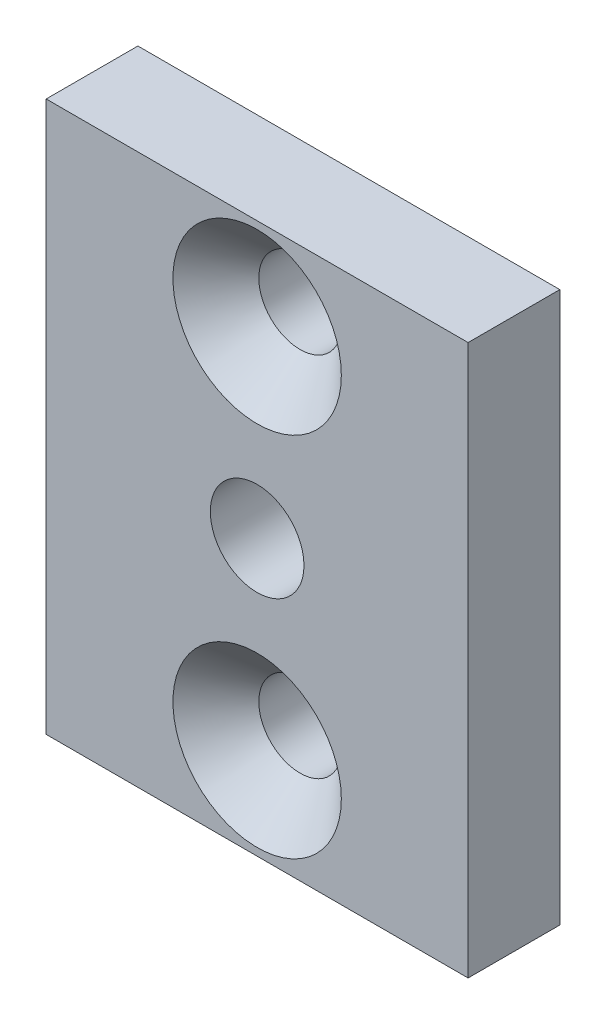
ISO-10303-21;
HEADER;
FILE_DESCRIPTION(('STEP AP214'),'2;1');
FILE_NAME('part.step','',(''),(''),'','','');
FILE_SCHEMA(('AUTOMOTIVE_DESIGN { 1 0 10303 214 1 1 1 1 }'));
ENDSEC;
DATA;
#1=APPLICATION_CONTEXT('core data for automotive mechanical design processes');
#2=APPLICATION_PROTOCOL_DEFINITION('international standard','automotive_design',2000,#1);
#3=PRODUCT_CONTEXT('',#1,'mechanical');
#4=PRODUCT('Part','Part','',(#3));
#5=PRODUCT_RELATED_PRODUCT_CATEGORY('part','',(#4));
#6=PRODUCT_DEFINITION_FORMATION('','',#4);
#7=PRODUCT_DEFINITION_CONTEXT('part definition',#1,'design');
#8=PRODUCT_DEFINITION('design','',#6,#7);
#9=PRODUCT_DEFINITION_SHAPE('','',#8);
#10=(LENGTH_UNIT() NAMED_UNIT(*) SI_UNIT(.MILLI.,.METRE.));
#11=(NAMED_UNIT(*) PLANE_ANGLE_UNIT() SI_UNIT($,.RADIAN.));
#12=(NAMED_UNIT(*) SI_UNIT($,.STERADIAN.) SOLID_ANGLE_UNIT());
#13=UNCERTAINTY_MEASURE_WITH_UNIT(LENGTH_MEASURE(1.E-05),#10,'distance_accuracy_value','');
#14=(GEOMETRIC_REPRESENTATION_CONTEXT(3) GLOBAL_UNCERTAINTY_ASSIGNED_CONTEXT((#13)) GLOBAL_UNIT_ASSIGNED_CONTEXT((#10,
#11,#12)) REPRESENTATION_CONTEXT('',''));
#15=CARTESIAN_POINT('',(0.,0.,0.));
#16=DIRECTION('',(0.,0.,1.));
#17=DIRECTION('',(1.,0.,0.));
#18=AXIS2_PLACEMENT_3D('',#15,#16,#17);
#19=CARTESIAN_POINT('',(0.,0.,5.));
#20=DIRECTION('',(1.,0.,0.));
#21=DIRECTION('',(0.,0.,-1.));
#22=AXIS2_PLACEMENT_3D('',#19,#20,#21);
#23=PLANE('',#22);
#24=DIRECTION('',(0.,-1.,0.));
#25=VECTOR('',#24,1.);
#26=CARTESIAN_POINT('',(0.,0.,0.));
#27=LINE('',#26,#25);
#28=CARTESIAN_POINT('',(0.,30.,0.));
#29=VERTEX_POINT('',#28);
#30=CARTESIAN_POINT('',(0.,0.,0.));
#31=VERTEX_POINT('',#30);
#32=EDGE_CURVE('E115',#29,#31,#27,.T.);
#33=ORIENTED_EDGE('',*,*,#32,.T.);
#34=DIRECTION('',(0.,0.,-1.));
#35=VECTOR('',#34,1.);
#36=CARTESIAN_POINT('',(0.,0.,5.));
#37=LINE('',#36,#35);
#38=CARTESIAN_POINT('',(0.,0.,5.));
#39=VERTEX_POINT('',#38);
#40=EDGE_CURVE('E11',#39,#31,#37,.T.);
#41=ORIENTED_EDGE('',*,*,#40,.F.);
#42=DIRECTION('',(0.,-1.,0.));
#43=VECTOR('',#42,1.);
#44=CARTESIAN_POINT('',(0.,0.,5.));
#45=LINE('',#44,#43);
#46=CARTESIAN_POINT('',(0.,30.,5.));
#47=VERTEX_POINT('',#46);
#48=EDGE_CURVE('E99',#47,#39,#45,.T.);
#49=ORIENTED_EDGE('',*,*,#48,.F.);
#50=DIRECTION('',(0.,0.,-1.));
#51=VECTOR('',#50,1.);
#52=CARTESIAN_POINT('',(0.,30.,5.));
#53=LINE('',#52,#51);
#54=EDGE_CURVE('E111',#47,#29,#53,.T.);
#55=ORIENTED_EDGE('',*,*,#54,.T.);
#56=EDGE_LOOP('',(#33,#41,#49,#55));
#57=FACE_BOUND('',#56,.T.);
#58=ADVANCED_FACE('F47',(#57),#23,.F.);
#59=CARTESIAN_POINT('',(0.,0.,5.));
#60=DIRECTION('',(0.,1.,0.));
#61=DIRECTION('',(0.,0.,1.));
#62=AXIS2_PLACEMENT_3D('',#59,#60,#61);
#63=PLANE('',#62);
#64=DIRECTION('',(1.,0.,0.));
#65=VECTOR('',#64,1.);
#66=CARTESIAN_POINT('',(0.,0.,0.));
#67=LINE('',#66,#65);
#68=CARTESIAN_POINT('',(23.,0.,0.));
#69=VERTEX_POINT('',#68);
#70=EDGE_CURVE('E104',#31,#69,#67,.T.);
#71=ORIENTED_EDGE('',*,*,#70,.T.);
#72=DIRECTION('',(0.,0.,-1.));
#73=VECTOR('',#72,1.);
#74=CARTESIAN_POINT('',(23.,0.,5.));
#75=LINE('',#74,#73);
#76=CARTESIAN_POINT('',(23.,0.,5.));
#77=VERTEX_POINT('',#76);
#78=EDGE_CURVE('E56',#77,#69,#75,.T.);
#79=ORIENTED_EDGE('',*,*,#78,.F.);
#80=DIRECTION('',(1.,0.,0.));
#81=VECTOR('',#80,1.);
#82=CARTESIAN_POINT('',(0.,0.,5.));
#83=LINE('',#82,#81);
#84=EDGE_CURVE('E94',#39,#77,#83,.T.);
#85=ORIENTED_EDGE('',*,*,#84,.F.);
#86=ORIENTED_EDGE('',*,*,#40,.T.);
#87=EDGE_LOOP('',(#71,#79,#85,#86));
#88=FACE_BOUND('',#87,.T.);
#89=ADVANCED_FACE('F103',(#88),#63,.F.);
#90=CARTESIAN_POINT('',(23.,0.,5.));
#91=DIRECTION('',(-1.,0.,0.));
#92=DIRECTION('',(0.,0.,1.));
#93=AXIS2_PLACEMENT_3D('',#90,#91,#92);
#94=PLANE('',#93);
#95=DIRECTION('',(0.,1.,0.));
#96=VECTOR('',#95,1.);
#97=CARTESIAN_POINT('',(23.,0.,0.));
#98=LINE('',#97,#96);
#99=CARTESIAN_POINT('',(23.,30.,0.));
#100=VERTEX_POINT('',#99);
#101=EDGE_CURVE('E81',#69,#100,#98,.T.);
#102=ORIENTED_EDGE('',*,*,#101,.T.);
#103=DIRECTION('',(0.,0.,-1.));
#104=VECTOR('',#103,1.);
#105=CARTESIAN_POINT('',(23.,30.,5.));
#106=LINE('',#105,#104);
#107=CARTESIAN_POINT('',(23.,30.,5.));
#108=VERTEX_POINT('',#107);
#109=EDGE_CURVE('E106',#108,#100,#106,.T.);
#110=ORIENTED_EDGE('',*,*,#109,.F.);
#111=DIRECTION('',(0.,1.,0.));
#112=VECTOR('',#111,1.);
#113=CARTESIAN_POINT('',(23.,0.,5.));
#114=LINE('',#113,#112);
#115=EDGE_CURVE('E97',#77,#108,#114,.T.);
#116=ORIENTED_EDGE('',*,*,#115,.F.);
#117=ORIENTED_EDGE('',*,*,#78,.T.);
#118=EDGE_LOOP('',(#102,#110,#116,#117));
#119=FACE_BOUND('',#118,.T.);
#120=ADVANCED_FACE('F107',(#119),#94,.F.);
#121=CARTESIAN_POINT('',(0.,30.,5.));
#122=DIRECTION('',(0.,-1.,0.));
#123=DIRECTION('',(0.,0.,-1.));
#124=AXIS2_PLACEMENT_3D('',#121,#122,#123);
#125=PLANE('',#124);
#126=DIRECTION('',(-1.,0.,0.));
#127=VECTOR('',#126,1.);
#128=CARTESIAN_POINT('',(0.,30.,0.));
#129=LINE('',#128,#127);
#130=EDGE_CURVE('E87',#100,#29,#129,.T.);
#131=ORIENTED_EDGE('',*,*,#130,.T.);
#132=ORIENTED_EDGE('',*,*,#54,.F.);
#133=DIRECTION('',(-1.,0.,0.));
#134=VECTOR('',#133,1.);
#135=CARTESIAN_POINT('',(0.,30.,5.));
#136=LINE('',#135,#134);
#137=EDGE_CURVE('E64',#108,#47,#136,.T.);
#138=ORIENTED_EDGE('',*,*,#137,.F.);
#139=ORIENTED_EDGE('',*,*,#109,.T.);
#140=EDGE_LOOP('',(#131,#132,#138,#139));
#141=FACE_BOUND('',#140,.T.);
#142=ADVANCED_FACE('F129',(#141),#125,.F.);
#143=CARTESIAN_POINT('',(0.,0.,5.));
#144=DIRECTION('',(0.,0.,-1.));
#145=DIRECTION('',(-1.,0.,0.));
#146=AXIS2_PLACEMENT_3D('',#143,#144,#145);
#147=PLANE('',#146);
#148=CARTESIAN_POINT('',(11.5,15.,5.));
#149=DIRECTION('',(0.,0.,1.));
#150=DIRECTION('',(1.,0.,0.));
#151=AXIS2_PLACEMENT_3D('',#148,#149,#150);
#152=CIRCLE('',#151,2.5527);
#153=CARTESIAN_POINT('',(14.0527,15.,5.));
#154=VERTEX_POINT('',#153);
#155=EDGE_CURVE('E163',#154,#154,#152,.T.);
#156=ORIENTED_EDGE('',*,*,#155,.F.);
#157=EDGE_LOOP('',(#156));
#158=FACE_BOUND('',#157,.T.);
#159=CARTESIAN_POINT('',(11.5,25.,5.));
#160=DIRECTION('',(0.,0.,1.));
#161=DIRECTION('',(1.,0.,0.));
#162=AXIS2_PLACEMENT_3D('',#159,#160,#161);
#163=CIRCLE('',#162,4.59);
#164=CARTESIAN_POINT('',(16.09,25.,5.));
#165=VERTEX_POINT('',#164);
#166=EDGE_CURVE('E155',#165,#165,#163,.T.);
#167=ORIENTED_EDGE('',*,*,#166,.F.);
#168=EDGE_LOOP('',(#167));
#169=FACE_BOUND('',#168,.T.);
#170=CARTESIAN_POINT('',(11.5,5.,5.));
#171=DIRECTION('',(0.,0.,1.));
#172=DIRECTION('',(1.,0.,0.));
#173=AXIS2_PLACEMENT_3D('',#170,#171,#172);
#174=CIRCLE('',#173,4.59);
#175=CARTESIAN_POINT('',(16.09,5.,5.));
#176=VERTEX_POINT('',#175);
#177=EDGE_CURVE('E143',#176,#176,#174,.T.);
#178=ORIENTED_EDGE('',*,*,#177,.F.);
#179=EDGE_LOOP('',(#178));
#180=FACE_BOUND('',#179,.T.);
#181=ORIENTED_EDGE('',*,*,#48,.T.);
#182=ORIENTED_EDGE('',*,*,#84,.T.);
#183=ORIENTED_EDGE('',*,*,#115,.T.);
#184=ORIENTED_EDGE('',*,*,#137,.T.);
#185=EDGE_LOOP('',(#181,#182,#183,#184));
#186=FACE_BOUND('',#185,.T.);
#187=ADVANCED_FACE('F95',(#158,#169,#180,#186),#147,.F.);
#188=CARTESIAN_POINT('',(0.,0.,0.));
#189=DIRECTION('',(0.,0.,-1.));
#190=DIRECTION('',(-1.,0.,0.));
#191=AXIS2_PLACEMENT_3D('',#188,#189,#190);
#192=PLANE('',#191);
#193=CARTESIAN_POINT('',(11.5,15.,0.));
#194=DIRECTION('',(0.,0.,1.));
#195=DIRECTION('',(1.,0.,0.));
#196=AXIS2_PLACEMENT_3D('',#193,#194,#195);
#197=CIRCLE('',#196,2.5527);
#198=CARTESIAN_POINT('',(14.0527,15.,0.));
#199=VERTEX_POINT('',#198);
#200=EDGE_CURVE('E159',#199,#199,#197,.T.);
#201=ORIENTED_EDGE('',*,*,#200,.T.);
#202=EDGE_LOOP('',(#201));
#203=FACE_BOUND('',#202,.T.);
#204=CARTESIAN_POINT('',(11.5,25.,0.));
#205=DIRECTION('',(0.,0.,1.));
#206=DIRECTION('',(1.,0.,0.));
#207=AXIS2_PLACEMENT_3D('',#204,#205,#206);
#208=CIRCLE('',#207,2.25);
#209=CARTESIAN_POINT('',(13.75,25.,0.));
#210=VERTEX_POINT('',#209);
#211=EDGE_CURVE('E147',#210,#210,#208,.T.);
#212=ORIENTED_EDGE('',*,*,#211,.T.);
#213=EDGE_LOOP('',(#212));
#214=FACE_BOUND('',#213,.T.);
#215=CARTESIAN_POINT('',(11.5,5.,0.));
#216=DIRECTION('',(0.,0.,1.));
#217=DIRECTION('',(1.,0.,0.));
#218=AXIS2_PLACEMENT_3D('',#215,#216,#217);
#219=CIRCLE('',#218,2.25);
#220=CARTESIAN_POINT('',(13.75,5.,0.));
#221=VERTEX_POINT('',#220);
#222=EDGE_CURVE('E119',#221,#221,#219,.T.);
#223=ORIENTED_EDGE('',*,*,#222,.T.);
#224=EDGE_LOOP('',(#223));
#225=FACE_BOUND('',#224,.T.);
#226=ORIENTED_EDGE('',*,*,#32,.F.);
#227=ORIENTED_EDGE('',*,*,#130,.F.);
#228=ORIENTED_EDGE('',*,*,#101,.F.);
#229=ORIENTED_EDGE('',*,*,#70,.F.);
#230=EDGE_LOOP('',(#226,#227,#228,#229));
#231=FACE_BOUND('',#230,.T.);
#232=ADVANCED_FACE('F132',(#203,#214,#225,#231),#192,.T.);
#233=CARTESIAN_POINT('',(11.5,5.,5.));
#234=DIRECTION('',(0.,0.,1.));
#235=DIRECTION('',(1.,0.,0.));
#236=AXIS2_PLACEMENT_3D('',#233,#234,#235);
#237=CYLINDRICAL_SURFACE('',#236,2.25);
#238=ORIENTED_EDGE('',*,*,#222,.F.);
#239=EDGE_LOOP('',(#238));
#240=FACE_BOUND('',#239,.T.);
#241=CARTESIAN_POINT('',(11.5,5.,2.66));
#242=DIRECTION('',(0.,0.,1.));
#243=DIRECTION('',(1.,0.,0.));
#244=AXIS2_PLACEMENT_3D('',#241,#242,#243);
#245=CIRCLE('',#244,2.25);
#246=CARTESIAN_POINT('',(13.75,5.,2.66));
#247=VERTEX_POINT('',#246);
#248=EDGE_CURVE('E139',#247,#247,#245,.T.);
#249=ORIENTED_EDGE('',*,*,#248,.T.);
#250=EDGE_LOOP('',(#249));
#251=FACE_BOUND('',#250,.T.);
#252=ADVANCED_FACE('F180',(#240,#251),#237,.F.);
#253=CARTESIAN_POINT('',(11.5,5.,5.));
#254=DIRECTION('',(0.,0.,1.));
#255=DIRECTION('',(1.,0.,0.));
#256=AXIS2_PLACEMENT_3D('',#253,#254,#255);
#257=CONICAL_SURFACE('',#256,4.59,0.785398163397448);
#258=ORIENTED_EDGE('',*,*,#248,.F.);
#259=EDGE_LOOP('',(#258));
#260=FACE_BOUND('',#259,.T.);
#261=ORIENTED_EDGE('',*,*,#177,.T.);
#262=EDGE_LOOP('',(#261));
#263=FACE_BOUND('',#262,.T.);
#264=ADVANCED_FACE('F177',(#260,#263),#257,.F.);
#265=CARTESIAN_POINT('',(11.5,25.,5.));
#266=DIRECTION('',(0.,0.,1.));
#267=DIRECTION('',(1.,0.,0.));
#268=AXIS2_PLACEMENT_3D('',#265,#266,#267);
#269=CYLINDRICAL_SURFACE('',#268,2.25);
#270=ORIENTED_EDGE('',*,*,#211,.F.);
#271=EDGE_LOOP('',(#270));
#272=FACE_BOUND('',#271,.T.);
#273=CARTESIAN_POINT('',(11.5,25.,2.66));
#274=DIRECTION('',(0.,0.,1.));
#275=DIRECTION('',(1.,0.,0.));
#276=AXIS2_PLACEMENT_3D('',#273,#274,#275);
#277=CIRCLE('',#276,2.25);
#278=CARTESIAN_POINT('',(13.75,25.,2.66));
#279=VERTEX_POINT('',#278);
#280=EDGE_CURVE('E151',#279,#279,#277,.T.);
#281=ORIENTED_EDGE('',*,*,#280,.T.);
#282=EDGE_LOOP('',(#281));
#283=FACE_BOUND('',#282,.T.);
#284=ADVANCED_FACE('F179',(#272,#283),#269,.F.);
#285=CARTESIAN_POINT('',(11.5,25.,5.));
#286=DIRECTION('',(0.,0.,1.));
#287=DIRECTION('',(1.,0.,0.));
#288=AXIS2_PLACEMENT_3D('',#285,#286,#287);
#289=CONICAL_SURFACE('',#288,4.59,0.785398163397448);
#290=ORIENTED_EDGE('',*,*,#280,.F.);
#291=EDGE_LOOP('',(#290));
#292=FACE_BOUND('',#291,.T.);
#293=ORIENTED_EDGE('',*,*,#166,.T.);
#294=EDGE_LOOP('',(#293));
#295=FACE_BOUND('',#294,.T.);
#296=ADVANCED_FACE('F187',(#292,#295),#289,.F.);
#297=CARTESIAN_POINT('',(11.5,15.,5.));
#298=DIRECTION('',(0.,0.,1.));
#299=DIRECTION('',(1.,0.,0.));
#300=AXIS2_PLACEMENT_3D('',#297,#298,#299);
#301=CYLINDRICAL_SURFACE('',#300,2.5527);
#302=ORIENTED_EDGE('',*,*,#200,.F.);
#303=EDGE_LOOP('',(#302));
#304=FACE_BOUND('',#303,.T.);
#305=ORIENTED_EDGE('',*,*,#155,.T.);
#306=EDGE_LOOP('',(#305));
#307=FACE_BOUND('',#306,.T.);
#308=ADVANCED_FACE('F168',(#304,#307),#301,.F.);
#309=CLOSED_SHELL('',(#58,#89,#120,#142,#187,#232,#252,#264,#284,#296,#308));
#310=MANIFOLD_SOLID_BREP('B2',#309);
#311=ADVANCED_BREP_SHAPE_REPRESENTATION('',(#18,#310),#14);
#312=SHAPE_DEFINITION_REPRESENTATION(#9,#311);
ENDSEC;
END-ISO-10303-21;
